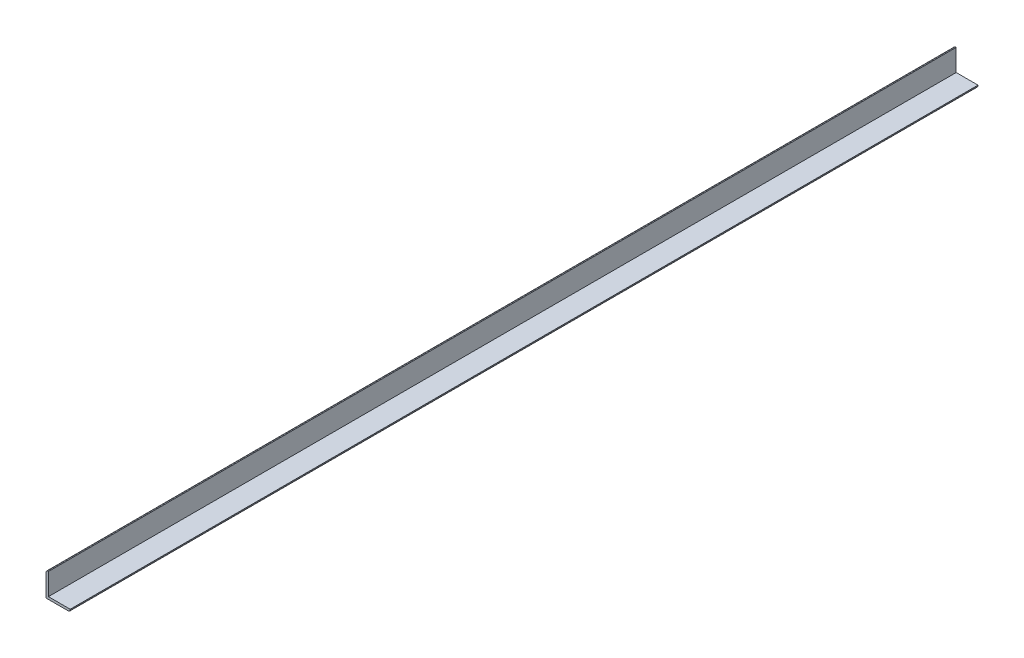
ISO-10303-21;
HEADER;
FILE_DESCRIPTION(('STEP AP214'),'2;1');
FILE_NAME('part.step','',(''),(''),'','','');
FILE_SCHEMA(('AUTOMOTIVE_DESIGN { 1 0 10303 214 1 1 1 1 }'));
ENDSEC;
DATA;
#1=APPLICATION_CONTEXT('core data for automotive mechanical design processes');
#2=APPLICATION_PROTOCOL_DEFINITION('international standard','automotive_design',2000,#1);
#3=PRODUCT_CONTEXT('',#1,'mechanical');
#4=PRODUCT('Part','Part','',(#3));
#5=PRODUCT_RELATED_PRODUCT_CATEGORY('part','',(#4));
#6=PRODUCT_DEFINITION_FORMATION('','',#4);
#7=PRODUCT_DEFINITION_CONTEXT('part definition',#1,'design');
#8=PRODUCT_DEFINITION('design','',#6,#7);
#9=PRODUCT_DEFINITION_SHAPE('','',#8);
#10=(LENGTH_UNIT() NAMED_UNIT(*) SI_UNIT(.MILLI.,.METRE.));
#11=(NAMED_UNIT(*) PLANE_ANGLE_UNIT() SI_UNIT($,.RADIAN.));
#12=(NAMED_UNIT(*) SI_UNIT($,.STERADIAN.) SOLID_ANGLE_UNIT());
#13=UNCERTAINTY_MEASURE_WITH_UNIT(LENGTH_MEASURE(1.E-05),#10,'distance_accuracy_value','');
#14=(GEOMETRIC_REPRESENTATION_CONTEXT(3) GLOBAL_UNCERTAINTY_ASSIGNED_CONTEXT((#13)) GLOBAL_UNIT_ASSIGNED_CONTEXT((#10,
#11,#12)) REPRESENTATION_CONTEXT('',''));
#15=CARTESIAN_POINT('',(0.,0.,0.));
#16=DIRECTION('',(0.,0.,1.));
#17=DIRECTION('',(1.,0.,0.));
#18=AXIS2_PLACEMENT_3D('',#15,#16,#17);
#19=CARTESIAN_POINT('',(0.,37.,1556.56854249492));
#20=DIRECTION('',(1.,0.,0.));
#21=DIRECTION('',(0.,1.,0.));
#22=AXIS2_PLACEMENT_3D('',#19,#20,#21);
#23=PLANE('',#22);
#24=DIRECTION('',(0.,-1.,0.));
#25=VECTOR('',#24,1.);
#26=CARTESIAN_POINT('',(0.,37.,1500.));
#27=LINE('',#26,#25);
#28=CARTESIAN_POINT('',(0.,37.,1500.));
#29=VERTEX_POINT('',#28);
#30=CARTESIAN_POINT('',(0.,0.,1500.));
#31=VERTEX_POINT('',#30);
#32=EDGE_CURVE('E134',#29,#31,#27,.T.);
#33=ORIENTED_EDGE('',*,*,#32,.F.);
#34=DIRECTION('',(0.,0.,-1.));
#35=VECTOR('',#34,1.);
#36=CARTESIAN_POINT('',(0.,37.,1556.56854249492));
#37=LINE('',#36,#35);
#38=CARTESIAN_POINT('',(0.,37.,0.));
#39=VERTEX_POINT('',#38);
#40=EDGE_CURVE('E39',#29,#39,#37,.T.);
#41=ORIENTED_EDGE('',*,*,#40,.T.);
#42=DIRECTION('',(0.,-1.,0.));
#43=VECTOR('',#42,1.);
#44=CARTESIAN_POINT('',(0.,37.,0.));
#45=LINE('',#44,#43);
#46=CARTESIAN_POINT('',(0.,0.,0.));
#47=VERTEX_POINT('',#46);
#48=EDGE_CURVE('E142',#39,#47,#45,.T.);
#49=ORIENTED_EDGE('',*,*,#48,.T.);
#50=DIRECTION('',(0.,0.,-1.));
#51=VECTOR('',#50,1.);
#52=CARTESIAN_POINT('',(0.,0.,1556.56854249492));
#53=LINE('',#52,#51);
#54=EDGE_CURVE('E90',#31,#47,#53,.T.);
#55=ORIENTED_EDGE('',*,*,#54,.F.);
#56=EDGE_LOOP('',(#33,#41,#49,#55));
#57=FACE_BOUND('',#56,.T.);
#58=ADVANCED_FACE('F35',(#57),#23,.F.);
#59=CARTESIAN_POINT('',(0.,0.,1556.56854249492));
#60=DIRECTION('',(0.,1.,0.));
#61=DIRECTION('',(0.,0.,1.));
#62=AXIS2_PLACEMENT_3D('',#59,#60,#61);
#63=PLANE('',#62);
#64=DIRECTION('',(1.,0.,0.));
#65=VECTOR('',#64,1.);
#66=CARTESIAN_POINT('',(0.,0.,1500.));
#67=LINE('',#66,#65);
#68=CARTESIAN_POINT('',(37.,0.,1500.));
#69=VERTEX_POINT('',#68);
#70=EDGE_CURVE('E97',#31,#69,#67,.T.);
#71=ORIENTED_EDGE('',*,*,#70,.F.);
#72=ORIENTED_EDGE('',*,*,#54,.T.);
#73=DIRECTION('',(1.,0.,0.));
#74=VECTOR('',#73,1.);
#75=CARTESIAN_POINT('',(0.,0.,0.));
#76=LINE('',#75,#74);
#77=CARTESIAN_POINT('',(37.,0.,0.));
#78=VERTEX_POINT('',#77);
#79=EDGE_CURVE('E141',#47,#78,#76,.T.);
#80=ORIENTED_EDGE('',*,*,#79,.T.);
#81=DIRECTION('',(0.,0.,-1.));
#82=VECTOR('',#81,1.);
#83=CARTESIAN_POINT('',(37.,0.,1556.56854249492));
#84=LINE('',#83,#82);
#85=EDGE_CURVE('E143',#69,#78,#84,.T.);
#86=ORIENTED_EDGE('',*,*,#85,.F.);
#87=EDGE_LOOP('',(#71,#72,#80,#86));
#88=FACE_BOUND('',#87,.T.);
#89=ADVANCED_FACE('F172',(#88),#63,.F.);
#90=CARTESIAN_POINT('',(37.,3.,1556.56854249492));
#91=DIRECTION('',(0.,0.,-1.));
#92=DIRECTION('',(-1.,0.,0.));
#93=AXIS2_PLACEMENT_3D('',#90,#91,#92);
#94=CYLINDRICAL_SURFACE('',#93,3.);
#95=CARTESIAN_POINT('',(37.,3.,1500.));
#96=DIRECTION('',(0.,0.,1.));
#97=DIRECTION('',(0.,-1.,0.));
#98=AXIS2_PLACEMENT_3D('',#95,#96,#97);
#99=CIRCLE('',#98,3.);
#100=CARTESIAN_POINT('',(40.,3.00000000000002,1500.));
#101=VERTEX_POINT('',#100);
#102=EDGE_CURVE('E130',#69,#101,#99,.T.);
#103=ORIENTED_EDGE('',*,*,#102,.F.);
#104=ORIENTED_EDGE('',*,*,#85,.T.);
#105=CARTESIAN_POINT('',(37.,3.,0.));
#106=DIRECTION('',(0.,0.,1.));
#107=DIRECTION('',(1.,0.,0.));
#108=AXIS2_PLACEMENT_3D('',#105,#106,#107);
#109=CIRCLE('',#108,3.);
#110=CARTESIAN_POINT('',(40.,3.00000000000002,0.));
#111=VERTEX_POINT('',#110);
#112=EDGE_CURVE('E145',#78,#111,#109,.T.);
#113=ORIENTED_EDGE('',*,*,#112,.T.);
#114=DIRECTION('',(0.,0.,-1.));
#115=VECTOR('',#114,1.);
#116=CARTESIAN_POINT('',(40.,3.00000000000002,1556.56854249492));
#117=LINE('',#116,#115);
#118=EDGE_CURVE('E146',#101,#111,#117,.T.);
#119=ORIENTED_EDGE('',*,*,#118,.F.);
#120=EDGE_LOOP('',(#103,#104,#113,#119));
#121=FACE_BOUND('',#120,.T.);
#122=ADVANCED_FACE('F175',(#121),#94,.T.);
#123=CARTESIAN_POINT('',(40.,3.00000000000002,1556.56854249492));
#124=DIRECTION('',(-1.,0.,0.));
#125=DIRECTION('',(0.,0.,1.));
#126=AXIS2_PLACEMENT_3D('',#123,#124,#125);
#127=PLANE('',#126);
#128=DIRECTION('',(0.,1.,0.));
#129=VECTOR('',#128,1.);
#130=CARTESIAN_POINT('',(40.,3.00000000000003,1500.));
#131=LINE('',#130,#129);
#132=CARTESIAN_POINT('',(40.,4.,1500.));
#133=VERTEX_POINT('',#132);
#134=EDGE_CURVE('E125',#101,#133,#131,.T.);
#135=ORIENTED_EDGE('',*,*,#134,.F.);
#136=ORIENTED_EDGE('',*,*,#118,.T.);
#137=DIRECTION('',(0.,1.,0.));
#138=VECTOR('',#137,1.);
#139=CARTESIAN_POINT('',(40.,3.00000000000002,0.));
#140=LINE('',#139,#138);
#141=CARTESIAN_POINT('',(40.,4.,0.));
#142=VERTEX_POINT('',#141);
#143=EDGE_CURVE('E148',#111,#142,#140,.T.);
#144=ORIENTED_EDGE('',*,*,#143,.T.);
#145=DIRECTION('',(0.,0.,-1.));
#146=VECTOR('',#145,1.);
#147=CARTESIAN_POINT('',(40.,4.,1556.56854249492));
#148=LINE('',#147,#146);
#149=EDGE_CURVE('E149',#133,#142,#148,.T.);
#150=ORIENTED_EDGE('',*,*,#149,.F.);
#151=EDGE_LOOP('',(#135,#136,#144,#150));
#152=FACE_BOUND('',#151,.T.);
#153=ADVANCED_FACE('F177',(#152),#127,.F.);
#154=CARTESIAN_POINT('',(4.,4.,1556.56854249492));
#155=DIRECTION('',(0.,-1.,0.));
#156=DIRECTION('',(1.,0.,0.));
#157=AXIS2_PLACEMENT_3D('',#154,#155,#156);
#158=PLANE('',#157);
#159=DIRECTION('',(-1.,0.,0.));
#160=VECTOR('',#159,1.);
#161=CARTESIAN_POINT('',(4.,4.,1500.));
#162=LINE('',#161,#160);
#163=CARTESIAN_POINT('',(4.,4.,1500.));
#164=VERTEX_POINT('',#163);
#165=EDGE_CURVE('E123',#133,#164,#162,.T.);
#166=ORIENTED_EDGE('',*,*,#165,.F.);
#167=ORIENTED_EDGE('',*,*,#149,.T.);
#168=DIRECTION('',(-1.,0.,0.));
#169=VECTOR('',#168,1.);
#170=CARTESIAN_POINT('',(4.,4.,0.));
#171=LINE('',#170,#169);
#172=CARTESIAN_POINT('',(4.,4.,0.));
#173=VERTEX_POINT('',#172);
#174=EDGE_CURVE('E151',#142,#173,#171,.T.);
#175=ORIENTED_EDGE('',*,*,#174,.T.);
#176=DIRECTION('',(0.,0.,-1.));
#177=VECTOR('',#176,1.);
#178=CARTESIAN_POINT('',(4.,4.,1556.56854249492));
#179=LINE('',#178,#177);
#180=EDGE_CURVE('E152',#164,#173,#179,.T.);
#181=ORIENTED_EDGE('',*,*,#180,.F.);
#182=EDGE_LOOP('',(#166,#167,#175,#181));
#183=FACE_BOUND('',#182,.T.);
#184=ADVANCED_FACE('F181',(#183),#158,.F.);
#185=CARTESIAN_POINT('',(4.,4.,1556.56854249492));
#186=DIRECTION('',(-1.,0.,0.));
#187=DIRECTION('',(0.,-1.,0.));
#188=AXIS2_PLACEMENT_3D('',#185,#186,#187);
#189=PLANE('',#188);
#190=DIRECTION('',(0.,1.,0.));
#191=VECTOR('',#190,1.);
#192=CARTESIAN_POINT('',(4.,4.00000000000001,1500.));
#193=LINE('',#192,#191);
#194=CARTESIAN_POINT('',(3.99999999999999,40.,1500.));
#195=VERTEX_POINT('',#194);
#196=EDGE_CURVE('E44',#164,#195,#193,.T.);
#197=ORIENTED_EDGE('',*,*,#196,.F.);
#198=ORIENTED_EDGE('',*,*,#180,.T.);
#199=DIRECTION('',(0.,1.,0.));
#200=VECTOR('',#199,1.);
#201=CARTESIAN_POINT('',(4.,4.,0.));
#202=LINE('',#201,#200);
#203=CARTESIAN_POINT('',(3.99999999999999,40.,0.));
#204=VERTEX_POINT('',#203);
#205=EDGE_CURVE('E117',#173,#204,#202,.T.);
#206=ORIENTED_EDGE('',*,*,#205,.T.);
#207=DIRECTION('',(0.,0.,-1.));
#208=VECTOR('',#207,1.);
#209=CARTESIAN_POINT('',(3.99999999999999,40.,1556.56854249492));
#210=LINE('',#209,#208);
#211=EDGE_CURVE('E108',#195,#204,#210,.T.);
#212=ORIENTED_EDGE('',*,*,#211,.F.);
#213=EDGE_LOOP('',(#197,#198,#206,#212));
#214=FACE_BOUND('',#213,.T.);
#215=ADVANCED_FACE('F114',(#214),#189,.F.);
#216=CARTESIAN_POINT('',(3.99999999999999,40.,1556.56854249492));
#217=DIRECTION('',(0.,-1.,0.));
#218=DIRECTION('',(0.,0.,-1.));
#219=AXIS2_PLACEMENT_3D('',#216,#217,#218);
#220=PLANE('',#219);
#221=DIRECTION('',(-1.,0.,0.));
#222=VECTOR('',#221,1.);
#223=CARTESIAN_POINT('',(3.99999999999999,40.,1500.));
#224=LINE('',#223,#222);
#225=CARTESIAN_POINT('',(3.00000000000001,40.,1500.));
#226=VERTEX_POINT('',#225);
#227=EDGE_CURVE('E11',#195,#226,#224,.T.);
#228=ORIENTED_EDGE('',*,*,#227,.F.);
#229=ORIENTED_EDGE('',*,*,#211,.T.);
#230=DIRECTION('',(-1.,0.,0.));
#231=VECTOR('',#230,1.);
#232=CARTESIAN_POINT('',(3.99999999999999,40.,0.));
#233=LINE('',#232,#231);
#234=CARTESIAN_POINT('',(3.00000000000001,40.,0.));
#235=VERTEX_POINT('',#234);
#236=EDGE_CURVE('E119',#204,#235,#233,.T.);
#237=ORIENTED_EDGE('',*,*,#236,.T.);
#238=DIRECTION('',(0.,0.,-1.));
#239=VECTOR('',#238,1.);
#240=CARTESIAN_POINT('',(3.00000000000001,40.,1556.56854249492));
#241=LINE('',#240,#239);
#242=EDGE_CURVE('E57',#226,#235,#241,.T.);
#243=ORIENTED_EDGE('',*,*,#242,.F.);
#244=EDGE_LOOP('',(#228,#229,#237,#243));
#245=FACE_BOUND('',#244,.T.);
#246=ADVANCED_FACE('F107',(#245),#220,.F.);
#247=CARTESIAN_POINT('',(2.99999999999999,37.,1556.56854249492));
#248=DIRECTION('',(0.,0.,-1.));
#249=DIRECTION('',(-1.,0.,0.));
#250=AXIS2_PLACEMENT_3D('',#247,#248,#249);
#251=CYLINDRICAL_SURFACE('',#250,3.);
#252=CARTESIAN_POINT('',(2.99999999999999,37.,1500.));
#253=DIRECTION('',(0.,0.,1.));
#254=DIRECTION('',(0.,-1.,0.));
#255=AXIS2_PLACEMENT_3D('',#252,#253,#254);
#256=CIRCLE('',#255,3.);
#257=EDGE_CURVE('E137',#226,#29,#256,.T.);
#258=ORIENTED_EDGE('',*,*,#257,.F.);
#259=ORIENTED_EDGE('',*,*,#242,.T.);
#260=CARTESIAN_POINT('',(2.99999999999999,37.,0.));
#261=DIRECTION('',(0.,0.,1.));
#262=DIRECTION('',(1.,0.,0.));
#263=AXIS2_PLACEMENT_3D('',#260,#261,#262);
#264=CIRCLE('',#263,3.);
#265=EDGE_CURVE('E139',#235,#39,#264,.T.);
#266=ORIENTED_EDGE('',*,*,#265,.T.);
#267=ORIENTED_EDGE('',*,*,#40,.F.);
#268=EDGE_LOOP('',(#258,#259,#266,#267));
#269=FACE_BOUND('',#268,.T.);
#270=ADVANCED_FACE('F167',(#269),#251,.T.);
#271=CARTESIAN_POINT('',(37.,3.,0.));
#272=DIRECTION('',(0.,0.,1.));
#273=DIRECTION('',(1.,0.,0.));
#274=AXIS2_PLACEMENT_3D('',#271,#272,#273);
#275=PLANE('',#274);
#276=ORIENTED_EDGE('',*,*,#48,.F.);
#277=ORIENTED_EDGE('',*,*,#265,.F.);
#278=ORIENTED_EDGE('',*,*,#236,.F.);
#279=ORIENTED_EDGE('',*,*,#205,.F.);
#280=ORIENTED_EDGE('',*,*,#174,.F.);
#281=ORIENTED_EDGE('',*,*,#143,.F.);
#282=ORIENTED_EDGE('',*,*,#112,.F.);
#283=ORIENTED_EDGE('',*,*,#79,.F.);
#284=EDGE_LOOP('',(#276,#277,#278,#279,#280,#281,#282,#283));
#285=FACE_BOUND('',#284,.T.);
#286=ADVANCED_FACE('F169',(#285),#275,.F.);
#287=CARTESIAN_POINT('',(4384.001,3.99999999999756,1500.));
#288=DIRECTION('',(0.,0.,1.));
#289=DIRECTION('',(0.,1.,0.));
#290=AXIS2_PLACEMENT_3D('',#287,#288,#289);
#291=PLANE('',#290);
#292=ORIENTED_EDGE('',*,*,#257,.T.);
#293=ORIENTED_EDGE('',*,*,#32,.T.);
#294=ORIENTED_EDGE('',*,*,#70,.T.);
#295=ORIENTED_EDGE('',*,*,#102,.T.);
#296=ORIENTED_EDGE('',*,*,#134,.T.);
#297=ORIENTED_EDGE('',*,*,#165,.T.);
#298=ORIENTED_EDGE('',*,*,#196,.T.);
#299=ORIENTED_EDGE('',*,*,#227,.T.);
#300=EDGE_LOOP('',(#292,#293,#294,#295,#296,#297,#298,#299));
#301=FACE_BOUND('',#300,.T.);
#302=ADVANCED_FACE('F37',(#301),#291,.T.);
#303=CLOSED_SHELL('',(#58,#89,#122,#153,#184,#215,#246,#270,#286,#302));
#304=MANIFOLD_SOLID_BREP('B2',#303);
#305=ADVANCED_BREP_SHAPE_REPRESENTATION('',(#18,#304),#14);
#306=SHAPE_DEFINITION_REPRESENTATION(#9,#305);
ENDSEC;
END-ISO-10303-21;
